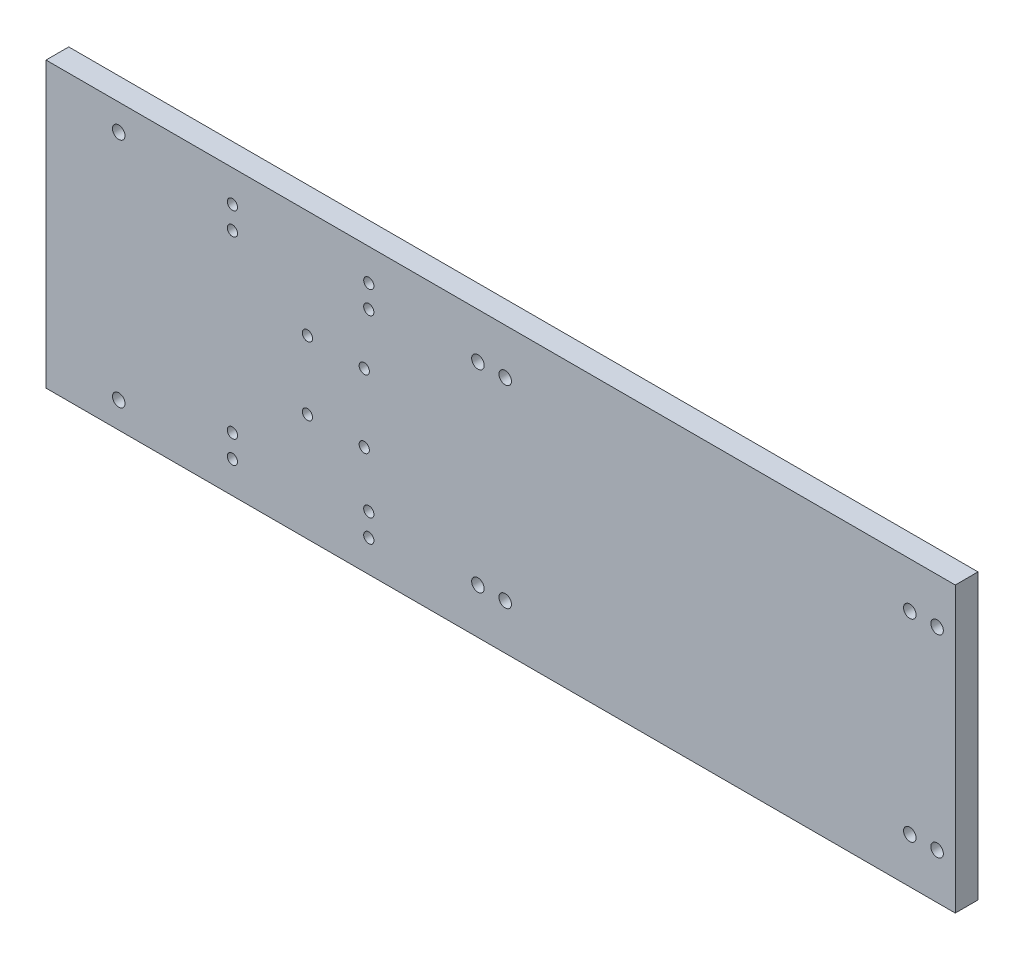
ISO-10303-21;
HEADER;
FILE_DESCRIPTION(('STEP AP214'),'2;1');
FILE_NAME('part.step','',(''),(''),'','','');
FILE_SCHEMA(('AUTOMOTIVE_DESIGN { 1 0 10303 214 1 1 1 1 }'));
ENDSEC;
DATA;
#1=APPLICATION_CONTEXT('core data for automotive mechanical design processes');
#2=APPLICATION_PROTOCOL_DEFINITION('international standard','automotive_design',2000,#1);
#3=PRODUCT_CONTEXT('',#1,'mechanical');
#4=PRODUCT('Part','Part','',(#3));
#5=PRODUCT_RELATED_PRODUCT_CATEGORY('part','',(#4));
#6=PRODUCT_DEFINITION_FORMATION('','',#4);
#7=PRODUCT_DEFINITION_CONTEXT('part definition',#1,'design');
#8=PRODUCT_DEFINITION('design','',#6,#7);
#9=PRODUCT_DEFINITION_SHAPE('','',#8);
#10=(LENGTH_UNIT() NAMED_UNIT(*) SI_UNIT(.MILLI.,.METRE.));
#11=(NAMED_UNIT(*) PLANE_ANGLE_UNIT() SI_UNIT($,.RADIAN.));
#12=(NAMED_UNIT(*) SI_UNIT($,.STERADIAN.) SOLID_ANGLE_UNIT());
#13=UNCERTAINTY_MEASURE_WITH_UNIT(LENGTH_MEASURE(1.E-05),#10,'distance_accuracy_value','');
#14=(GEOMETRIC_REPRESENTATION_CONTEXT(3) GLOBAL_UNCERTAINTY_ASSIGNED_CONTEXT((#13)) GLOBAL_UNIT_ASSIGNED_CONTEXT((#10,
#11,#12)) REPRESENTATION_CONTEXT('',''));
#15=CARTESIAN_POINT('',(0.,0.,0.));
#16=DIRECTION('',(0.,0.,1.));
#17=DIRECTION('',(1.,0.,0.));
#18=AXIS2_PLACEMENT_3D('',#15,#16,#17);
#19=CARTESIAN_POINT('',(200.,-62.5,10.));
#20=DIRECTION('',(-1.,0.,0.));
#21=DIRECTION('',(0.,0.,1.));
#22=AXIS2_PLACEMENT_3D('',#19,#20,#21);
#23=PLANE('',#22);
#24=DIRECTION('',(0.,1.,0.));
#25=VECTOR('',#24,1.);
#26=CARTESIAN_POINT('',(200.,-62.5,0.));
#27=LINE('',#26,#25);
#28=CARTESIAN_POINT('',(200.,-62.5,0.));
#29=VERTEX_POINT('',#28);
#30=CARTESIAN_POINT('',(200.,62.5,0.));
#31=VERTEX_POINT('',#30);
#32=EDGE_CURVE('E97',#29,#31,#27,.T.);
#33=ORIENTED_EDGE('',*,*,#32,.T.);
#34=DIRECTION('',(0.,0.,-1.));
#35=VECTOR('',#34,1.);
#36=CARTESIAN_POINT('',(200.,62.5,10.));
#37=LINE('',#36,#35);
#38=CARTESIAN_POINT('',(200.,62.5,10.));
#39=VERTEX_POINT('',#38);
#40=EDGE_CURVE('E11',#39,#31,#37,.T.);
#41=ORIENTED_EDGE('',*,*,#40,.F.);
#42=DIRECTION('',(0.,1.,0.));
#43=VECTOR('',#42,1.);
#44=CARTESIAN_POINT('',(200.,-62.5,10.));
#45=LINE('',#44,#43);
#46=CARTESIAN_POINT('',(200.,-62.5,10.));
#47=VERTEX_POINT('',#46);
#48=EDGE_CURVE('E85',#47,#39,#45,.T.);
#49=ORIENTED_EDGE('',*,*,#48,.F.);
#50=DIRECTION('',(0.,0.,-1.));
#51=VECTOR('',#50,1.);
#52=CARTESIAN_POINT('',(200.,-62.5,10.));
#53=LINE('',#52,#51);
#54=EDGE_CURVE('E93',#47,#29,#53,.T.);
#55=ORIENTED_EDGE('',*,*,#54,.T.);
#56=EDGE_LOOP('',(#33,#41,#49,#55));
#57=FACE_BOUND('',#56,.T.);
#58=ADVANCED_FACE('F34',(#57),#23,.F.);
#59=CARTESIAN_POINT('',(-200.,62.5,10.));
#60=DIRECTION('',(0.,-1.,0.));
#61=DIRECTION('',(0.,0.,-1.));
#62=AXIS2_PLACEMENT_3D('',#59,#60,#61);
#63=PLANE('',#62);
#64=DIRECTION('',(-1.,0.,0.));
#65=VECTOR('',#64,1.);
#66=CARTESIAN_POINT('',(-200.,62.5,0.));
#67=LINE('',#66,#65);
#68=CARTESIAN_POINT('',(-200.,62.5,0.));
#69=VERTEX_POINT('',#68);
#70=EDGE_CURVE('E89',#31,#69,#67,.T.);
#71=ORIENTED_EDGE('',*,*,#70,.T.);
#72=DIRECTION('',(0.,0.,-1.));
#73=VECTOR('',#72,1.);
#74=CARTESIAN_POINT('',(-200.,62.5,10.));
#75=LINE('',#74,#73);
#76=CARTESIAN_POINT('',(-200.,62.5,10.));
#77=VERTEX_POINT('',#76);
#78=EDGE_CURVE('E42',#77,#69,#75,.T.);
#79=ORIENTED_EDGE('',*,*,#78,.F.);
#80=DIRECTION('',(-1.,0.,0.));
#81=VECTOR('',#80,1.);
#82=CARTESIAN_POINT('',(-200.,62.5,10.));
#83=LINE('',#82,#81);
#84=EDGE_CURVE('E80',#39,#77,#83,.T.);
#85=ORIENTED_EDGE('',*,*,#84,.F.);
#86=ORIENTED_EDGE('',*,*,#40,.T.);
#87=EDGE_LOOP('',(#71,#79,#85,#86));
#88=FACE_BOUND('',#87,.T.);
#89=ADVANCED_FACE('F88',(#88),#63,.F.);
#90=CARTESIAN_POINT('',(-200.,-62.5,10.));
#91=DIRECTION('',(1.,0.,0.));
#92=DIRECTION('',(0.,0.,-1.));
#93=AXIS2_PLACEMENT_3D('',#90,#91,#92);
#94=PLANE('',#93);
#95=DIRECTION('',(0.,-1.,0.));
#96=VECTOR('',#95,1.);
#97=CARTESIAN_POINT('',(-200.,-62.5,0.));
#98=LINE('',#97,#96);
#99=CARTESIAN_POINT('',(-200.,-62.5,0.));
#100=VERTEX_POINT('',#99);
#101=EDGE_CURVE('E67',#69,#100,#98,.T.);
#102=ORIENTED_EDGE('',*,*,#101,.T.);
#103=DIRECTION('',(0.,0.,-1.));
#104=VECTOR('',#103,1.);
#105=CARTESIAN_POINT('',(-200.,-62.5,10.));
#106=LINE('',#105,#104);
#107=CARTESIAN_POINT('',(-200.,-62.5,10.));
#108=VERTEX_POINT('',#107);
#109=EDGE_CURVE('E90',#108,#100,#106,.T.);
#110=ORIENTED_EDGE('',*,*,#109,.F.);
#111=DIRECTION('',(0.,-1.,0.));
#112=VECTOR('',#111,1.);
#113=CARTESIAN_POINT('',(-200.,-62.5,10.));
#114=LINE('',#113,#112);
#115=EDGE_CURVE('E83',#77,#108,#114,.T.);
#116=ORIENTED_EDGE('',*,*,#115,.F.);
#117=ORIENTED_EDGE('',*,*,#78,.T.);
#118=EDGE_LOOP('',(#102,#110,#116,#117));
#119=FACE_BOUND('',#118,.T.);
#120=ADVANCED_FACE('F91',(#119),#94,.F.);
#121=CARTESIAN_POINT('',(-200.,-62.5,10.));
#122=DIRECTION('',(0.,1.,0.));
#123=DIRECTION('',(0.,0.,1.));
#124=AXIS2_PLACEMENT_3D('',#121,#122,#123);
#125=PLANE('',#124);
#126=DIRECTION('',(1.,0.,0.));
#127=VECTOR('',#126,1.);
#128=CARTESIAN_POINT('',(-200.,-62.5,0.));
#129=LINE('',#128,#127);
#130=EDGE_CURVE('E73',#100,#29,#129,.T.);
#131=ORIENTED_EDGE('',*,*,#130,.T.);
#132=ORIENTED_EDGE('',*,*,#54,.F.);
#133=DIRECTION('',(1.,0.,0.));
#134=VECTOR('',#133,1.);
#135=CARTESIAN_POINT('',(-200.,-62.5,10.));
#136=LINE('',#135,#134);
#137=EDGE_CURVE('E50',#108,#47,#136,.T.);
#138=ORIENTED_EDGE('',*,*,#137,.F.);
#139=ORIENTED_EDGE('',*,*,#109,.T.);
#140=EDGE_LOOP('',(#131,#132,#138,#139));
#141=FACE_BOUND('',#140,.T.);
#142=ADVANCED_FACE('F105',(#141),#125,.F.);
#143=CARTESIAN_POINT('',(0.,0.,10.));
#144=DIRECTION('',(0.,0.,-1.));
#145=DIRECTION('',(-1.,0.,0.));
#146=AXIS2_PLACEMENT_3D('',#143,#144,#145);
#147=PLANE('',#146);
#148=CARTESIAN_POINT('',(-58.,38.5,10.));
#149=DIRECTION('',(0.,0.,-1.));
#150=DIRECTION('',(-1.,0.,0.));
#151=AXIS2_PLACEMENT_3D('',#148,#149,#150);
#152=CIRCLE('',#151,2.25);
#153=CARTESIAN_POINT('',(-60.25,38.5,10.));
#154=VERTEX_POINT('',#153);
#155=EDGE_CURVE('E236',#154,#154,#152,.T.);
#156=ORIENTED_EDGE('',*,*,#155,.T.);
#157=EDGE_LOOP('',(#156));
#158=FACE_BOUND('',#157,.T.);
#159=CARTESIAN_POINT('',(-118.,38.5,10.));
#160=DIRECTION('',(0.,0.,-1.));
#161=DIRECTION('',(-1.,0.,0.));
#162=AXIS2_PLACEMENT_3D('',#159,#160,#161);
#163=CIRCLE('',#162,2.25);
#164=CARTESIAN_POINT('',(-120.25,38.5,10.));
#165=VERTEX_POINT('',#164);
#166=EDGE_CURVE('E230',#165,#165,#163,.T.);
#167=ORIENTED_EDGE('',*,*,#166,.T.);
#168=EDGE_LOOP('',(#167));
#169=FACE_BOUND('',#168,.T.);
#170=CARTESIAN_POINT('',(-118.,-38.5,10.));
#171=DIRECTION('',(0.,0.,-1.));
#172=DIRECTION('',(-1.,0.,0.));
#173=AXIS2_PLACEMENT_3D('',#170,#171,#172);
#174=CIRCLE('',#173,2.25);
#175=CARTESIAN_POINT('',(-120.25,-38.5,10.));
#176=VERTEX_POINT('',#175);
#177=EDGE_CURVE('E224',#176,#176,#174,.T.);
#178=ORIENTED_EDGE('',*,*,#177,.T.);
#179=EDGE_LOOP('',(#178));
#180=FACE_BOUND('',#179,.T.);
#181=CARTESIAN_POINT('',(-58.,-38.5,10.));
#182=DIRECTION('',(0.,0.,-1.));
#183=DIRECTION('',(-1.,0.,0.));
#184=AXIS2_PLACEMENT_3D('',#181,#182,#183);
#185=CIRCLE('',#184,2.25);
#186=CARTESIAN_POINT('',(-60.25,-38.5,10.));
#187=VERTEX_POINT('',#186);
#188=EDGE_CURVE('E218',#187,#187,#185,.T.);
#189=ORIENTED_EDGE('',*,*,#188,.T.);
#190=EDGE_LOOP('',(#189));
#191=FACE_BOUND('',#190,.T.);
#192=CARTESIAN_POINT('',(-60.,-15.,10.));
#193=DIRECTION('',(0.,0.,-1.));
#194=DIRECTION('',(-1.,0.,0.));
#195=AXIS2_PLACEMENT_3D('',#192,#193,#194);
#196=CIRCLE('',#195,2.25);
#197=CARTESIAN_POINT('',(-62.25,-15.,10.));
#198=VERTEX_POINT('',#197);
#199=EDGE_CURVE('E212',#198,#198,#196,.T.);
#200=ORIENTED_EDGE('',*,*,#199,.T.);
#201=EDGE_LOOP('',(#200));
#202=FACE_BOUND('',#201,.T.);
#203=CARTESIAN_POINT('',(-85.,-15.,10.));
#204=DIRECTION('',(0.,0.,-1.));
#205=DIRECTION('',(-1.,0.,0.));
#206=AXIS2_PLACEMENT_3D('',#203,#204,#205);
#207=CIRCLE('',#206,2.25);
#208=CARTESIAN_POINT('',(-87.25,-15.,10.));
#209=VERTEX_POINT('',#208);
#210=EDGE_CURVE('E206',#209,#209,#207,.T.);
#211=ORIENTED_EDGE('',*,*,#210,.T.);
#212=EDGE_LOOP('',(#211));
#213=FACE_BOUND('',#212,.T.);
#214=CARTESIAN_POINT('',(-85.,15.,10.));
#215=DIRECTION('',(0.,0.,-1.));
#216=DIRECTION('',(-1.,0.,0.));
#217=AXIS2_PLACEMENT_3D('',#214,#215,#216);
#218=CIRCLE('',#217,2.25);
#219=CARTESIAN_POINT('',(-87.25,15.,10.));
#220=VERTEX_POINT('',#219);
#221=EDGE_CURVE('E200',#220,#220,#218,.T.);
#222=ORIENTED_EDGE('',*,*,#221,.T.);
#223=EDGE_LOOP('',(#222));
#224=FACE_BOUND('',#223,.T.);
#225=CARTESIAN_POINT('',(-60.,14.9999999999999,10.));
#226=DIRECTION('',(0.,0.,-1.));
#227=DIRECTION('',(-1.,0.,0.));
#228=AXIS2_PLACEMENT_3D('',#225,#226,#227);
#229=CIRCLE('',#228,2.25);
#230=CARTESIAN_POINT('',(-62.25,14.9999999999999,10.));
#231=VERTEX_POINT('',#230);
#232=EDGE_CURVE('E194',#231,#231,#229,.T.);
#233=ORIENTED_EDGE('',*,*,#232,.T.);
#234=EDGE_LOOP('',(#233));
#235=FACE_BOUND('',#234,.T.);
#236=CARTESIAN_POINT('',(-58.,-48.5,10.));
#237=DIRECTION('',(0.,0.,-1.));
#238=DIRECTION('',(-1.,0.,0.));
#239=AXIS2_PLACEMENT_3D('',#236,#237,#238);
#240=CIRCLE('',#239,2.25);
#241=CARTESIAN_POINT('',(-60.25,-48.5,10.));
#242=VERTEX_POINT('',#241);
#243=EDGE_CURVE('E188',#242,#242,#240,.T.);
#244=ORIENTED_EDGE('',*,*,#243,.T.);
#245=EDGE_LOOP('',(#244));
#246=FACE_BOUND('',#245,.T.);
#247=CARTESIAN_POINT('',(-118.,-48.5000000000001,10.));
#248=DIRECTION('',(0.,0.,-1.));
#249=DIRECTION('',(-1.,0.,0.));
#250=AXIS2_PLACEMENT_3D('',#247,#248,#249);
#251=CIRCLE('',#250,2.25);
#252=CARTESIAN_POINT('',(-120.25,-48.5000000000001,10.));
#253=VERTEX_POINT('',#252);
#254=EDGE_CURVE('E182',#253,#253,#251,.T.);
#255=ORIENTED_EDGE('',*,*,#254,.T.);
#256=EDGE_LOOP('',(#255));
#257=FACE_BOUND('',#256,.T.);
#258=CARTESIAN_POINT('',(-58.,48.5,10.));
#259=DIRECTION('',(0.,0.,-1.));
#260=DIRECTION('',(-1.,0.,0.));
#261=AXIS2_PLACEMENT_3D('',#258,#259,#260);
#262=CIRCLE('',#261,2.25);
#263=CARTESIAN_POINT('',(-60.25,48.5,10.));
#264=VERTEX_POINT('',#263);
#265=EDGE_CURVE('E176',#264,#264,#262,.T.);
#266=ORIENTED_EDGE('',*,*,#265,.T.);
#267=EDGE_LOOP('',(#266));
#268=FACE_BOUND('',#267,.T.);
#269=CARTESIAN_POINT('',(-118.,48.5,10.));
#270=DIRECTION('',(0.,0.,-1.));
#271=DIRECTION('',(-1.,0.,0.));
#272=AXIS2_PLACEMENT_3D('',#269,#270,#271);
#273=CIRCLE('',#272,2.25);
#274=CARTESIAN_POINT('',(-120.25,48.5,10.));
#275=VERTEX_POINT('',#274);
#276=EDGE_CURVE('E170',#275,#275,#273,.T.);
#277=ORIENTED_EDGE('',*,*,#276,.T.);
#278=EDGE_LOOP('',(#277));
#279=FACE_BOUND('',#278,.T.);
#280=CARTESIAN_POINT('',(192.,42.5,10.));
#281=DIRECTION('',(0.,0.,-1.));
#282=DIRECTION('',(-1.,0.,0.));
#283=AXIS2_PLACEMENT_3D('',#280,#281,#282);
#284=CIRCLE('',#283,2.75);
#285=CARTESIAN_POINT('',(189.25,42.5,10.));
#286=VERTEX_POINT('',#285);
#287=EDGE_CURVE('E164',#286,#286,#284,.T.);
#288=ORIENTED_EDGE('',*,*,#287,.T.);
#289=EDGE_LOOP('',(#288));
#290=FACE_BOUND('',#289,.T.);
#291=CARTESIAN_POINT('',(180.,42.5,10.));
#292=DIRECTION('',(0.,0.,-1.));
#293=DIRECTION('',(-1.,0.,0.));
#294=AXIS2_PLACEMENT_3D('',#291,#292,#293);
#295=CIRCLE('',#294,2.75);
#296=CARTESIAN_POINT('',(177.25,42.5,10.));
#297=VERTEX_POINT('',#296);
#298=EDGE_CURVE('E158',#297,#297,#295,.T.);
#299=ORIENTED_EDGE('',*,*,#298,.T.);
#300=EDGE_LOOP('',(#299));
#301=FACE_BOUND('',#300,.T.);
#302=CARTESIAN_POINT('',(192.,-42.5,10.));
#303=DIRECTION('',(0.,0.,-1.));
#304=DIRECTION('',(-1.,0.,0.));
#305=AXIS2_PLACEMENT_3D('',#302,#303,#304);
#306=CIRCLE('',#305,2.75);
#307=CARTESIAN_POINT('',(189.25,-42.5,10.));
#308=VERTEX_POINT('',#307);
#309=EDGE_CURVE('E152',#308,#308,#306,.T.);
#310=ORIENTED_EDGE('',*,*,#309,.T.);
#311=EDGE_LOOP('',(#310));
#312=FACE_BOUND('',#311,.T.);
#313=CARTESIAN_POINT('',(180.,-42.5,10.));
#314=DIRECTION('',(0.,0.,-1.));
#315=DIRECTION('',(-1.,0.,0.));
#316=AXIS2_PLACEMENT_3D('',#313,#314,#315);
#317=CIRCLE('',#316,2.75);
#318=CARTESIAN_POINT('',(177.25,-42.5,10.));
#319=VERTEX_POINT('',#318);
#320=EDGE_CURVE('E146',#319,#319,#317,.T.);
#321=ORIENTED_EDGE('',*,*,#320,.T.);
#322=EDGE_LOOP('',(#321));
#323=FACE_BOUND('',#322,.T.);
#324=CARTESIAN_POINT('',(2.,42.5,10.));
#325=DIRECTION('',(0.,0.,-1.));
#326=DIRECTION('',(-1.,0.,0.));
#327=AXIS2_PLACEMENT_3D('',#324,#325,#326);
#328=CIRCLE('',#327,2.75);
#329=CARTESIAN_POINT('',(-0.749999999999997,42.5,10.));
#330=VERTEX_POINT('',#329);
#331=EDGE_CURVE('E140',#330,#330,#328,.T.);
#332=ORIENTED_EDGE('',*,*,#331,.T.);
#333=EDGE_LOOP('',(#332));
#334=FACE_BOUND('',#333,.T.);
#335=CARTESIAN_POINT('',(-9.99999999999999,42.5,10.));
#336=DIRECTION('',(0.,0.,-1.));
#337=DIRECTION('',(-1.,0.,0.));
#338=AXIS2_PLACEMENT_3D('',#335,#336,#337);
#339=CIRCLE('',#338,2.75);
#340=CARTESIAN_POINT('',(-12.75,42.5,10.));
#341=VERTEX_POINT('',#340);
#342=EDGE_CURVE('E134',#341,#341,#339,.T.);
#343=ORIENTED_EDGE('',*,*,#342,.T.);
#344=EDGE_LOOP('',(#343));
#345=FACE_BOUND('',#344,.T.);
#346=CARTESIAN_POINT('',(2.00000000000001,-42.5,10.));
#347=DIRECTION('',(0.,0.,-1.));
#348=DIRECTION('',(-1.,0.,0.));
#349=AXIS2_PLACEMENT_3D('',#346,#347,#348);
#350=CIRCLE('',#349,2.75);
#351=CARTESIAN_POINT('',(-0.749999999999987,-42.5,10.));
#352=VERTEX_POINT('',#351);
#353=EDGE_CURVE('E128',#352,#352,#350,.T.);
#354=ORIENTED_EDGE('',*,*,#353,.T.);
#355=EDGE_LOOP('',(#354));
#356=FACE_BOUND('',#355,.T.);
#357=CARTESIAN_POINT('',(-9.99999999999999,-42.5,10.));
#358=DIRECTION('',(0.,0.,-1.));
#359=DIRECTION('',(-1.,0.,0.));
#360=AXIS2_PLACEMENT_3D('',#357,#358,#359);
#361=CIRCLE('',#360,2.75);
#362=CARTESIAN_POINT('',(-12.75,-42.5,10.));
#363=VERTEX_POINT('',#362);
#364=EDGE_CURVE('E122',#363,#363,#361,.T.);
#365=ORIENTED_EDGE('',*,*,#364,.T.);
#366=EDGE_LOOP('',(#365));
#367=FACE_BOUND('',#366,.T.);
#368=CARTESIAN_POINT('',(-168.,50.9999999999999,10.));
#369=DIRECTION('',(0.,0.,-1.));
#370=DIRECTION('',(-1.,0.,0.));
#371=AXIS2_PLACEMENT_3D('',#368,#369,#370);
#372=CIRCLE('',#371,2.75);
#373=CARTESIAN_POINT('',(-170.75,50.9999999999999,10.));
#374=VERTEX_POINT('',#373);
#375=EDGE_CURVE('E116',#374,#374,#372,.T.);
#376=ORIENTED_EDGE('',*,*,#375,.T.);
#377=EDGE_LOOP('',(#376));
#378=FACE_BOUND('',#377,.T.);
#379=CARTESIAN_POINT('',(-168.,-51.,10.));
#380=DIRECTION('',(0.,0.,-1.));
#381=DIRECTION('',(-1.,0.,0.));
#382=AXIS2_PLACEMENT_3D('',#379,#380,#381);
#383=CIRCLE('',#382,2.75);
#384=CARTESIAN_POINT('',(-170.75,-51.,10.));
#385=VERTEX_POINT('',#384);
#386=EDGE_CURVE('E100',#385,#385,#383,.T.);
#387=ORIENTED_EDGE('',*,*,#386,.T.);
#388=EDGE_LOOP('',(#387));
#389=FACE_BOUND('',#388,.T.);
#390=ORIENTED_EDGE('',*,*,#48,.T.);
#391=ORIENTED_EDGE('',*,*,#84,.T.);
#392=ORIENTED_EDGE('',*,*,#115,.T.);
#393=ORIENTED_EDGE('',*,*,#137,.T.);
#394=EDGE_LOOP('',(#390,#391,#392,#393));
#395=FACE_BOUND('',#394,.T.);
#396=ADVANCED_FACE('F81',(#158,#169,#180,#191,#202,#213,#224,#235,#246,#257,#268,#279,#290,#301,
#312,#323,#334,#345,#356,#367,#378,#389,#395),#147,.F.);
#397=CARTESIAN_POINT('',(0.,0.,0.));
#398=DIRECTION('',(0.,0.,-1.));
#399=DIRECTION('',(-1.,0.,0.));
#400=AXIS2_PLACEMENT_3D('',#397,#398,#399);
#401=PLANE('',#400);
#402=CARTESIAN_POINT('',(-58.,38.5,0.));
#403=DIRECTION('',(0.,0.,-1.));
#404=DIRECTION('',(-1.,0.,0.));
#405=AXIS2_PLACEMENT_3D('',#402,#403,#404);
#406=CIRCLE('',#405,2.25);
#407=CARTESIAN_POINT('',(-60.25,38.5,0.));
#408=VERTEX_POINT('',#407);
#409=EDGE_CURVE('E239',#408,#408,#406,.T.);
#410=ORIENTED_EDGE('',*,*,#409,.F.);
#411=EDGE_LOOP('',(#410));
#412=FACE_BOUND('',#411,.T.);
#413=CARTESIAN_POINT('',(-118.,38.5,0.));
#414=DIRECTION('',(0.,0.,-1.));
#415=DIRECTION('',(-1.,0.,0.));
#416=AXIS2_PLACEMENT_3D('',#413,#414,#415);
#417=CIRCLE('',#416,2.25);
#418=CARTESIAN_POINT('',(-120.25,38.5,0.));
#419=VERTEX_POINT('',#418);
#420=EDGE_CURVE('E233',#419,#419,#417,.T.);
#421=ORIENTED_EDGE('',*,*,#420,.F.);
#422=EDGE_LOOP('',(#421));
#423=FACE_BOUND('',#422,.T.);
#424=CARTESIAN_POINT('',(-118.,-38.5,0.));
#425=DIRECTION('',(0.,0.,-1.));
#426=DIRECTION('',(-1.,0.,0.));
#427=AXIS2_PLACEMENT_3D('',#424,#425,#426);
#428=CIRCLE('',#427,2.25);
#429=CARTESIAN_POINT('',(-120.25,-38.5,0.));
#430=VERTEX_POINT('',#429);
#431=EDGE_CURVE('E227',#430,#430,#428,.T.);
#432=ORIENTED_EDGE('',*,*,#431,.F.);
#433=EDGE_LOOP('',(#432));
#434=FACE_BOUND('',#433,.T.);
#435=CARTESIAN_POINT('',(-58.,-38.5,0.));
#436=DIRECTION('',(0.,0.,-1.));
#437=DIRECTION('',(-1.,0.,0.));
#438=AXIS2_PLACEMENT_3D('',#435,#436,#437);
#439=CIRCLE('',#438,2.25);
#440=CARTESIAN_POINT('',(-60.25,-38.5,0.));
#441=VERTEX_POINT('',#440);
#442=EDGE_CURVE('E221',#441,#441,#439,.T.);
#443=ORIENTED_EDGE('',*,*,#442,.F.);
#444=EDGE_LOOP('',(#443));
#445=FACE_BOUND('',#444,.T.);
#446=CARTESIAN_POINT('',(-60.,-15.,0.));
#447=DIRECTION('',(0.,0.,-1.));
#448=DIRECTION('',(-1.,0.,0.));
#449=AXIS2_PLACEMENT_3D('',#446,#447,#448);
#450=CIRCLE('',#449,2.25);
#451=CARTESIAN_POINT('',(-62.25,-15.,0.));
#452=VERTEX_POINT('',#451);
#453=EDGE_CURVE('E215',#452,#452,#450,.T.);
#454=ORIENTED_EDGE('',*,*,#453,.F.);
#455=EDGE_LOOP('',(#454));
#456=FACE_BOUND('',#455,.T.);
#457=CARTESIAN_POINT('',(-85.,-15.,0.));
#458=DIRECTION('',(0.,0.,-1.));
#459=DIRECTION('',(-1.,0.,0.));
#460=AXIS2_PLACEMENT_3D('',#457,#458,#459);
#461=CIRCLE('',#460,2.25);
#462=CARTESIAN_POINT('',(-87.25,-15.,0.));
#463=VERTEX_POINT('',#462);
#464=EDGE_CURVE('E209',#463,#463,#461,.T.);
#465=ORIENTED_EDGE('',*,*,#464,.F.);
#466=EDGE_LOOP('',(#465));
#467=FACE_BOUND('',#466,.T.);
#468=CARTESIAN_POINT('',(-85.,15.,0.));
#469=DIRECTION('',(0.,0.,-1.));
#470=DIRECTION('',(-1.,0.,0.));
#471=AXIS2_PLACEMENT_3D('',#468,#469,#470);
#472=CIRCLE('',#471,2.25);
#473=CARTESIAN_POINT('',(-87.25,15.,0.));
#474=VERTEX_POINT('',#473);
#475=EDGE_CURVE('E203',#474,#474,#472,.T.);
#476=ORIENTED_EDGE('',*,*,#475,.F.);
#477=EDGE_LOOP('',(#476));
#478=FACE_BOUND('',#477,.T.);
#479=CARTESIAN_POINT('',(-60.,14.9999999999999,0.));
#480=DIRECTION('',(0.,0.,-1.));
#481=DIRECTION('',(-1.,0.,0.));
#482=AXIS2_PLACEMENT_3D('',#479,#480,#481);
#483=CIRCLE('',#482,2.25);
#484=CARTESIAN_POINT('',(-62.25,14.9999999999999,0.));
#485=VERTEX_POINT('',#484);
#486=EDGE_CURVE('E197',#485,#485,#483,.T.);
#487=ORIENTED_EDGE('',*,*,#486,.F.);
#488=EDGE_LOOP('',(#487));
#489=FACE_BOUND('',#488,.T.);
#490=CARTESIAN_POINT('',(-58.,-48.5,0.));
#491=DIRECTION('',(0.,0.,-1.));
#492=DIRECTION('',(-1.,0.,0.));
#493=AXIS2_PLACEMENT_3D('',#490,#491,#492);
#494=CIRCLE('',#493,2.25);
#495=CARTESIAN_POINT('',(-60.25,-48.5,0.));
#496=VERTEX_POINT('',#495);
#497=EDGE_CURVE('E191',#496,#496,#494,.T.);
#498=ORIENTED_EDGE('',*,*,#497,.F.);
#499=EDGE_LOOP('',(#498));
#500=FACE_BOUND('',#499,.T.);
#501=CARTESIAN_POINT('',(-118.,-48.5000000000001,0.));
#502=DIRECTION('',(0.,0.,-1.));
#503=DIRECTION('',(-1.,0.,0.));
#504=AXIS2_PLACEMENT_3D('',#501,#502,#503);
#505=CIRCLE('',#504,2.25);
#506=CARTESIAN_POINT('',(-120.25,-48.5000000000001,0.));
#507=VERTEX_POINT('',#506);
#508=EDGE_CURVE('E185',#507,#507,#505,.T.);
#509=ORIENTED_EDGE('',*,*,#508,.F.);
#510=EDGE_LOOP('',(#509));
#511=FACE_BOUND('',#510,.T.);
#512=CARTESIAN_POINT('',(-58.,48.5,0.));
#513=DIRECTION('',(0.,0.,-1.));
#514=DIRECTION('',(-1.,0.,0.));
#515=AXIS2_PLACEMENT_3D('',#512,#513,#514);
#516=CIRCLE('',#515,2.25);
#517=CARTESIAN_POINT('',(-60.25,48.5,0.));
#518=VERTEX_POINT('',#517);
#519=EDGE_CURVE('E179',#518,#518,#516,.T.);
#520=ORIENTED_EDGE('',*,*,#519,.F.);
#521=EDGE_LOOP('',(#520));
#522=FACE_BOUND('',#521,.T.);
#523=CARTESIAN_POINT('',(-118.,48.5,0.));
#524=DIRECTION('',(0.,0.,-1.));
#525=DIRECTION('',(-1.,0.,0.));
#526=AXIS2_PLACEMENT_3D('',#523,#524,#525);
#527=CIRCLE('',#526,2.25);
#528=CARTESIAN_POINT('',(-120.25,48.5,0.));
#529=VERTEX_POINT('',#528);
#530=EDGE_CURVE('E173',#529,#529,#527,.T.);
#531=ORIENTED_EDGE('',*,*,#530,.F.);
#532=EDGE_LOOP('',(#531));
#533=FACE_BOUND('',#532,.T.);
#534=CARTESIAN_POINT('',(192.,42.5,0.));
#535=DIRECTION('',(0.,0.,-1.));
#536=DIRECTION('',(-1.,0.,0.));
#537=AXIS2_PLACEMENT_3D('',#534,#535,#536);
#538=CIRCLE('',#537,2.75);
#539=CARTESIAN_POINT('',(189.25,42.5,0.));
#540=VERTEX_POINT('',#539);
#541=EDGE_CURVE('E167',#540,#540,#538,.T.);
#542=ORIENTED_EDGE('',*,*,#541,.F.);
#543=EDGE_LOOP('',(#542));
#544=FACE_BOUND('',#543,.T.);
#545=CARTESIAN_POINT('',(180.,42.5,0.));
#546=DIRECTION('',(0.,0.,-1.));
#547=DIRECTION('',(-1.,0.,0.));
#548=AXIS2_PLACEMENT_3D('',#545,#546,#547);
#549=CIRCLE('',#548,2.75);
#550=CARTESIAN_POINT('',(177.25,42.5,0.));
#551=VERTEX_POINT('',#550);
#552=EDGE_CURVE('E161',#551,#551,#549,.T.);
#553=ORIENTED_EDGE('',*,*,#552,.F.);
#554=EDGE_LOOP('',(#553));
#555=FACE_BOUND('',#554,.T.);
#556=CARTESIAN_POINT('',(192.,-42.5,0.));
#557=DIRECTION('',(0.,0.,-1.));
#558=DIRECTION('',(-1.,0.,0.));
#559=AXIS2_PLACEMENT_3D('',#556,#557,#558);
#560=CIRCLE('',#559,2.75);
#561=CARTESIAN_POINT('',(189.25,-42.5,0.));
#562=VERTEX_POINT('',#561);
#563=EDGE_CURVE('E155',#562,#562,#560,.T.);
#564=ORIENTED_EDGE('',*,*,#563,.F.);
#565=EDGE_LOOP('',(#564));
#566=FACE_BOUND('',#565,.T.);
#567=CARTESIAN_POINT('',(180.,-42.5,0.));
#568=DIRECTION('',(0.,0.,-1.));
#569=DIRECTION('',(-1.,0.,0.));
#570=AXIS2_PLACEMENT_3D('',#567,#568,#569);
#571=CIRCLE('',#570,2.75);
#572=CARTESIAN_POINT('',(177.25,-42.5,0.));
#573=VERTEX_POINT('',#572);
#574=EDGE_CURVE('E149',#573,#573,#571,.T.);
#575=ORIENTED_EDGE('',*,*,#574,.F.);
#576=EDGE_LOOP('',(#575));
#577=FACE_BOUND('',#576,.T.);
#578=CARTESIAN_POINT('',(2.,42.5,0.));
#579=DIRECTION('',(0.,0.,-1.));
#580=DIRECTION('',(-1.,0.,0.));
#581=AXIS2_PLACEMENT_3D('',#578,#579,#580);
#582=CIRCLE('',#581,2.75);
#583=CARTESIAN_POINT('',(-0.749999999999998,42.5,0.));
#584=VERTEX_POINT('',#583);
#585=EDGE_CURVE('E143',#584,#584,#582,.T.);
#586=ORIENTED_EDGE('',*,*,#585,.F.);
#587=EDGE_LOOP('',(#586));
#588=FACE_BOUND('',#587,.T.);
#589=CARTESIAN_POINT('',(-9.99999999999999,42.5,0.));
#590=DIRECTION('',(0.,0.,-1.));
#591=DIRECTION('',(-1.,0.,0.));
#592=AXIS2_PLACEMENT_3D('',#589,#590,#591);
#593=CIRCLE('',#592,2.75);
#594=CARTESIAN_POINT('',(-12.75,42.5,0.));
#595=VERTEX_POINT('',#594);
#596=EDGE_CURVE('E137',#595,#595,#593,.T.);
#597=ORIENTED_EDGE('',*,*,#596,.F.);
#598=EDGE_LOOP('',(#597));
#599=FACE_BOUND('',#598,.T.);
#600=CARTESIAN_POINT('',(2.00000000000001,-42.5,0.));
#601=DIRECTION('',(0.,0.,-1.));
#602=DIRECTION('',(-1.,0.,0.));
#603=AXIS2_PLACEMENT_3D('',#600,#601,#602);
#604=CIRCLE('',#603,2.75);
#605=CARTESIAN_POINT('',(-0.749999999999988,-42.5,0.));
#606=VERTEX_POINT('',#605);
#607=EDGE_CURVE('E131',#606,#606,#604,.T.);
#608=ORIENTED_EDGE('',*,*,#607,.F.);
#609=EDGE_LOOP('',(#608));
#610=FACE_BOUND('',#609,.T.);
#611=CARTESIAN_POINT('',(-9.99999999999999,-42.5,0.));
#612=DIRECTION('',(0.,0.,-1.));
#613=DIRECTION('',(-1.,0.,0.));
#614=AXIS2_PLACEMENT_3D('',#611,#612,#613);
#615=CIRCLE('',#614,2.75);
#616=CARTESIAN_POINT('',(-12.75,-42.5,0.));
#617=VERTEX_POINT('',#616);
#618=EDGE_CURVE('E125',#617,#617,#615,.T.);
#619=ORIENTED_EDGE('',*,*,#618,.F.);
#620=EDGE_LOOP('',(#619));
#621=FACE_BOUND('',#620,.T.);
#622=CARTESIAN_POINT('',(-168.,50.9999999999999,0.));
#623=DIRECTION('',(0.,0.,-1.));
#624=DIRECTION('',(-1.,0.,0.));
#625=AXIS2_PLACEMENT_3D('',#622,#623,#624);
#626=CIRCLE('',#625,2.75);
#627=CARTESIAN_POINT('',(-170.75,50.9999999999999,0.));
#628=VERTEX_POINT('',#627);
#629=EDGE_CURVE('E119',#628,#628,#626,.T.);
#630=ORIENTED_EDGE('',*,*,#629,.F.);
#631=EDGE_LOOP('',(#630));
#632=FACE_BOUND('',#631,.T.);
#633=CARTESIAN_POINT('',(-168.,-51.,0.));
#634=DIRECTION('',(0.,0.,-1.));
#635=DIRECTION('',(-1.,0.,0.));
#636=AXIS2_PLACEMENT_3D('',#633,#634,#635);
#637=CIRCLE('',#636,2.75);
#638=CARTESIAN_POINT('',(-170.75,-51.,0.));
#639=VERTEX_POINT('',#638);
#640=EDGE_CURVE('E113',#639,#639,#637,.T.);
#641=ORIENTED_EDGE('',*,*,#640,.F.);
#642=EDGE_LOOP('',(#641));
#643=FACE_BOUND('',#642,.T.);
#644=ORIENTED_EDGE('',*,*,#32,.F.);
#645=ORIENTED_EDGE('',*,*,#130,.F.);
#646=ORIENTED_EDGE('',*,*,#101,.F.);
#647=ORIENTED_EDGE('',*,*,#70,.F.);
#648=EDGE_LOOP('',(#644,#645,#646,#647));
#649=FACE_BOUND('',#648,.T.);
#650=ADVANCED_FACE('F108',(#412,#423,#434,#445,#456,#467,#478,#489,#500,#511,#522,#533,#544,
#555,#566,#577,#588,#599,#610,#621,#632,#643,#649),#401,.T.);
#651=CARTESIAN_POINT('',(-168.,-51.,0.));
#652=DIRECTION('',(0.,0.,-1.));
#653=DIRECTION('',(-1.,0.,0.));
#654=AXIS2_PLACEMENT_3D('',#651,#652,#653);
#655=CYLINDRICAL_SURFACE('',#654,2.75);
#656=ORIENTED_EDGE('',*,*,#386,.F.);
#657=EDGE_LOOP('',(#656));
#658=FACE_BOUND('',#657,.T.);
#659=ORIENTED_EDGE('',*,*,#640,.T.);
#660=EDGE_LOOP('',(#659));
#661=FACE_BOUND('',#660,.T.);
#662=ADVANCED_FACE('F247',(#658,#661),#655,.F.);
#663=CARTESIAN_POINT('',(-168.,50.9999999999999,0.));
#664=DIRECTION('',(0.,0.,-1.));
#665=DIRECTION('',(-1.,0.,0.));
#666=AXIS2_PLACEMENT_3D('',#663,#664,#665);
#667=CYLINDRICAL_SURFACE('',#666,2.75);
#668=ORIENTED_EDGE('',*,*,#375,.F.);
#669=EDGE_LOOP('',(#668));
#670=FACE_BOUND('',#669,.T.);
#671=ORIENTED_EDGE('',*,*,#629,.T.);
#672=EDGE_LOOP('',(#671));
#673=FACE_BOUND('',#672,.T.);
#674=ADVANCED_FACE('F292',(#670,#673),#667,.F.);
#675=CARTESIAN_POINT('',(-9.99999999999999,-42.5,0.));
#676=DIRECTION('',(0.,0.,-1.));
#677=DIRECTION('',(-1.,0.,0.));
#678=AXIS2_PLACEMENT_3D('',#675,#676,#677);
#679=CYLINDRICAL_SURFACE('',#678,2.75);
#680=ORIENTED_EDGE('',*,*,#364,.F.);
#681=EDGE_LOOP('',(#680));
#682=FACE_BOUND('',#681,.T.);
#683=ORIENTED_EDGE('',*,*,#618,.T.);
#684=EDGE_LOOP('',(#683));
#685=FACE_BOUND('',#684,.T.);
#686=ADVANCED_FACE('F298',(#682,#685),#679,.F.);
#687=CARTESIAN_POINT('',(2.00000000000001,-42.5,0.));
#688=DIRECTION('',(0.,0.,-1.));
#689=DIRECTION('',(-1.,0.,0.));
#690=AXIS2_PLACEMENT_3D('',#687,#688,#689);
#691=CYLINDRICAL_SURFACE('',#690,2.75);
#692=ORIENTED_EDGE('',*,*,#353,.F.);
#693=EDGE_LOOP('',(#692));
#694=FACE_BOUND('',#693,.T.);
#695=ORIENTED_EDGE('',*,*,#607,.T.);
#696=EDGE_LOOP('',(#695));
#697=FACE_BOUND('',#696,.T.);
#698=ADVANCED_FACE('F363',(#694,#697),#691,.F.);
#699=CARTESIAN_POINT('',(-9.99999999999999,42.5,0.));
#700=DIRECTION('',(0.,0.,-1.));
#701=DIRECTION('',(-1.,0.,0.));
#702=AXIS2_PLACEMENT_3D('',#699,#700,#701);
#703=CYLINDRICAL_SURFACE('',#702,2.75);
#704=ORIENTED_EDGE('',*,*,#342,.F.);
#705=EDGE_LOOP('',(#704));
#706=FACE_BOUND('',#705,.T.);
#707=ORIENTED_EDGE('',*,*,#596,.T.);
#708=EDGE_LOOP('',(#707));
#709=FACE_BOUND('',#708,.T.);
#710=ADVANCED_FACE('F368',(#706,#709),#703,.F.);
#711=CARTESIAN_POINT('',(2.,42.5,0.));
#712=DIRECTION('',(0.,0.,-1.));
#713=DIRECTION('',(-1.,0.,0.));
#714=AXIS2_PLACEMENT_3D('',#711,#712,#713);
#715=CYLINDRICAL_SURFACE('',#714,2.75);
#716=ORIENTED_EDGE('',*,*,#331,.F.);
#717=EDGE_LOOP('',(#716));
#718=FACE_BOUND('',#717,.T.);
#719=ORIENTED_EDGE('',*,*,#585,.T.);
#720=EDGE_LOOP('',(#719));
#721=FACE_BOUND('',#720,.T.);
#722=ADVANCED_FACE('F374',(#718,#721),#715,.F.);
#723=CARTESIAN_POINT('',(180.,-42.5,0.));
#724=DIRECTION('',(0.,0.,-1.));
#725=DIRECTION('',(-1.,0.,0.));
#726=AXIS2_PLACEMENT_3D('',#723,#724,#725);
#727=CYLINDRICAL_SURFACE('',#726,2.75);
#728=ORIENTED_EDGE('',*,*,#320,.F.);
#729=EDGE_LOOP('',(#728));
#730=FACE_BOUND('',#729,.T.);
#731=ORIENTED_EDGE('',*,*,#574,.T.);
#732=EDGE_LOOP('',(#731));
#733=FACE_BOUND('',#732,.T.);
#734=ADVANCED_FACE('F378',(#730,#733),#727,.F.);
#735=CARTESIAN_POINT('',(192.,-42.5,0.));
#736=DIRECTION('',(0.,0.,-1.));
#737=DIRECTION('',(-1.,0.,0.));
#738=AXIS2_PLACEMENT_3D('',#735,#736,#737);
#739=CYLINDRICAL_SURFACE('',#738,2.75);
#740=ORIENTED_EDGE('',*,*,#309,.F.);
#741=EDGE_LOOP('',(#740));
#742=FACE_BOUND('',#741,.T.);
#743=ORIENTED_EDGE('',*,*,#563,.T.);
#744=EDGE_LOOP('',(#743));
#745=FACE_BOUND('',#744,.T.);
#746=ADVANCED_FACE('F382',(#742,#745),#739,.F.);
#747=CARTESIAN_POINT('',(180.,42.5,0.));
#748=DIRECTION('',(0.,0.,-1.));
#749=DIRECTION('',(-1.,0.,0.));
#750=AXIS2_PLACEMENT_3D('',#747,#748,#749);
#751=CYLINDRICAL_SURFACE('',#750,2.75);
#752=ORIENTED_EDGE('',*,*,#298,.F.);
#753=EDGE_LOOP('',(#752));
#754=FACE_BOUND('',#753,.T.);
#755=ORIENTED_EDGE('',*,*,#552,.T.);
#756=EDGE_LOOP('',(#755));
#757=FACE_BOUND('',#756,.T.);
#758=ADVANCED_FACE('F386',(#754,#757),#751,.F.);
#759=CARTESIAN_POINT('',(192.,42.5,0.));
#760=DIRECTION('',(0.,0.,-1.));
#761=DIRECTION('',(-1.,0.,0.));
#762=AXIS2_PLACEMENT_3D('',#759,#760,#761);
#763=CYLINDRICAL_SURFACE('',#762,2.75);
#764=ORIENTED_EDGE('',*,*,#287,.F.);
#765=EDGE_LOOP('',(#764));
#766=FACE_BOUND('',#765,.T.);
#767=ORIENTED_EDGE('',*,*,#541,.T.);
#768=EDGE_LOOP('',(#767));
#769=FACE_BOUND('',#768,.T.);
#770=ADVANCED_FACE('F390',(#766,#769),#763,.F.);
#771=CARTESIAN_POINT('',(-118.,48.5,0.));
#772=DIRECTION('',(0.,0.,-1.));
#773=DIRECTION('',(-1.,0.,0.));
#774=AXIS2_PLACEMENT_3D('',#771,#772,#773);
#775=CYLINDRICAL_SURFACE('',#774,2.25);
#776=ORIENTED_EDGE('',*,*,#276,.F.);
#777=EDGE_LOOP('',(#776));
#778=FACE_BOUND('',#777,.T.);
#779=ORIENTED_EDGE('',*,*,#530,.T.);
#780=EDGE_LOOP('',(#779));
#781=FACE_BOUND('',#780,.T.);
#782=ADVANCED_FACE('F394',(#778,#781),#775,.F.);
#783=CARTESIAN_POINT('',(-58.,48.5,0.));
#784=DIRECTION('',(0.,0.,-1.));
#785=DIRECTION('',(-1.,0.,0.));
#786=AXIS2_PLACEMENT_3D('',#783,#784,#785);
#787=CYLINDRICAL_SURFACE('',#786,2.25);
#788=ORIENTED_EDGE('',*,*,#265,.F.);
#789=EDGE_LOOP('',(#788));
#790=FACE_BOUND('',#789,.T.);
#791=ORIENTED_EDGE('',*,*,#519,.T.);
#792=EDGE_LOOP('',(#791));
#793=FACE_BOUND('',#792,.T.);
#794=ADVANCED_FACE('F398',(#790,#793),#787,.F.);
#795=CARTESIAN_POINT('',(-118.,-48.5000000000001,0.));
#796=DIRECTION('',(0.,0.,-1.));
#797=DIRECTION('',(-1.,0.,0.));
#798=AXIS2_PLACEMENT_3D('',#795,#796,#797);
#799=CYLINDRICAL_SURFACE('',#798,2.25);
#800=ORIENTED_EDGE('',*,*,#254,.F.);
#801=EDGE_LOOP('',(#800));
#802=FACE_BOUND('',#801,.T.);
#803=ORIENTED_EDGE('',*,*,#508,.T.);
#804=EDGE_LOOP('',(#803));
#805=FACE_BOUND('',#804,.T.);
#806=ADVANCED_FACE('F402',(#802,#805),#799,.F.);
#807=CARTESIAN_POINT('',(-58.,-48.5,0.));
#808=DIRECTION('',(0.,0.,-1.));
#809=DIRECTION('',(-1.,0.,0.));
#810=AXIS2_PLACEMENT_3D('',#807,#808,#809);
#811=CYLINDRICAL_SURFACE('',#810,2.25);
#812=ORIENTED_EDGE('',*,*,#243,.F.);
#813=EDGE_LOOP('',(#812));
#814=FACE_BOUND('',#813,.T.);
#815=ORIENTED_EDGE('',*,*,#497,.T.);
#816=EDGE_LOOP('',(#815));
#817=FACE_BOUND('',#816,.T.);
#818=ADVANCED_FACE('F406',(#814,#817),#811,.F.);
#819=CARTESIAN_POINT('',(-60.,14.9999999999999,0.));
#820=DIRECTION('',(0.,0.,-1.));
#821=DIRECTION('',(-1.,0.,0.));
#822=AXIS2_PLACEMENT_3D('',#819,#820,#821);
#823=CYLINDRICAL_SURFACE('',#822,2.25);
#824=ORIENTED_EDGE('',*,*,#232,.F.);
#825=EDGE_LOOP('',(#824));
#826=FACE_BOUND('',#825,.T.);
#827=ORIENTED_EDGE('',*,*,#486,.T.);
#828=EDGE_LOOP('',(#827));
#829=FACE_BOUND('',#828,.T.);
#830=ADVANCED_FACE('F410',(#826,#829),#823,.F.);
#831=CARTESIAN_POINT('',(-85.,15.,0.));
#832=DIRECTION('',(0.,0.,-1.));
#833=DIRECTION('',(-1.,0.,0.));
#834=AXIS2_PLACEMENT_3D('',#831,#832,#833);
#835=CYLINDRICAL_SURFACE('',#834,2.25);
#836=ORIENTED_EDGE('',*,*,#221,.F.);
#837=EDGE_LOOP('',(#836));
#838=FACE_BOUND('',#837,.T.);
#839=ORIENTED_EDGE('',*,*,#475,.T.);
#840=EDGE_LOOP('',(#839));
#841=FACE_BOUND('',#840,.T.);
#842=ADVANCED_FACE('F414',(#838,#841),#835,.F.);
#843=CARTESIAN_POINT('',(-85.,-15.,0.));
#844=DIRECTION('',(0.,0.,-1.));
#845=DIRECTION('',(-1.,0.,0.));
#846=AXIS2_PLACEMENT_3D('',#843,#844,#845);
#847=CYLINDRICAL_SURFACE('',#846,2.25);
#848=ORIENTED_EDGE('',*,*,#210,.F.);
#849=EDGE_LOOP('',(#848));
#850=FACE_BOUND('',#849,.T.);
#851=ORIENTED_EDGE('',*,*,#464,.T.);
#852=EDGE_LOOP('',(#851));
#853=FACE_BOUND('',#852,.T.);
#854=ADVANCED_FACE('F418',(#850,#853),#847,.F.);
#855=CARTESIAN_POINT('',(-60.,-15.,0.));
#856=DIRECTION('',(0.,0.,-1.));
#857=DIRECTION('',(-1.,0.,0.));
#858=AXIS2_PLACEMENT_3D('',#855,#856,#857);
#859=CYLINDRICAL_SURFACE('',#858,2.25);
#860=ORIENTED_EDGE('',*,*,#199,.F.);
#861=EDGE_LOOP('',(#860));
#862=FACE_BOUND('',#861,.T.);
#863=ORIENTED_EDGE('',*,*,#453,.T.);
#864=EDGE_LOOP('',(#863));
#865=FACE_BOUND('',#864,.T.);
#866=ADVANCED_FACE('F422',(#862,#865),#859,.F.);
#867=CARTESIAN_POINT('',(-58.,-38.5,0.));
#868=DIRECTION('',(0.,0.,-1.));
#869=DIRECTION('',(-1.,0.,0.));
#870=AXIS2_PLACEMENT_3D('',#867,#868,#869);
#871=CYLINDRICAL_SURFACE('',#870,2.25);
#872=ORIENTED_EDGE('',*,*,#188,.F.);
#873=EDGE_LOOP('',(#872));
#874=FACE_BOUND('',#873,.T.);
#875=ORIENTED_EDGE('',*,*,#442,.T.);
#876=EDGE_LOOP('',(#875));
#877=FACE_BOUND('',#876,.T.);
#878=ADVANCED_FACE('F426',(#874,#877),#871,.F.);
#879=CARTESIAN_POINT('',(-118.,-38.5,0.));
#880=DIRECTION('',(0.,0.,-1.));
#881=DIRECTION('',(-1.,0.,0.));
#882=AXIS2_PLACEMENT_3D('',#879,#880,#881);
#883=CYLINDRICAL_SURFACE('',#882,2.25);
#884=ORIENTED_EDGE('',*,*,#177,.F.);
#885=EDGE_LOOP('',(#884));
#886=FACE_BOUND('',#885,.T.);
#887=ORIENTED_EDGE('',*,*,#431,.T.);
#888=EDGE_LOOP('',(#887));
#889=FACE_BOUND('',#888,.T.);
#890=ADVANCED_FACE('F430',(#886,#889),#883,.F.);
#891=CARTESIAN_POINT('',(-118.,38.5,0.));
#892=DIRECTION('',(0.,0.,-1.));
#893=DIRECTION('',(-1.,0.,0.));
#894=AXIS2_PLACEMENT_3D('',#891,#892,#893);
#895=CYLINDRICAL_SURFACE('',#894,2.25);
#896=ORIENTED_EDGE('',*,*,#166,.F.);
#897=EDGE_LOOP('',(#896));
#898=FACE_BOUND('',#897,.T.);
#899=ORIENTED_EDGE('',*,*,#420,.T.);
#900=EDGE_LOOP('',(#899));
#901=FACE_BOUND('',#900,.T.);
#902=ADVANCED_FACE('F434',(#898,#901),#895,.F.);
#903=CARTESIAN_POINT('',(-58.,38.5,0.));
#904=DIRECTION('',(0.,0.,-1.));
#905=DIRECTION('',(-1.,0.,0.));
#906=AXIS2_PLACEMENT_3D('',#903,#904,#905);
#907=CYLINDRICAL_SURFACE('',#906,2.25);
#908=ORIENTED_EDGE('',*,*,#155,.F.);
#909=EDGE_LOOP('',(#908));
#910=FACE_BOUND('',#909,.T.);
#911=ORIENTED_EDGE('',*,*,#409,.T.);
#912=EDGE_LOOP('',(#911));
#913=FACE_BOUND('',#912,.T.);
#914=ADVANCED_FACE('F243',(#910,#913),#907,.F.);
#915=CLOSED_SHELL('',(#58,#89,#120,#142,#396,#650,#662,#674,#686,#698,#710,#722,#734,#746,#758,
#770,#782,#794,#806,#818,#830,#842,#854,#866,#878,#890,#902,#914));
#916=MANIFOLD_SOLID_BREP('B2',#915);
#917=ADVANCED_BREP_SHAPE_REPRESENTATION('',(#18,#916),#14);
#918=SHAPE_DEFINITION_REPRESENTATION(#9,#917);
ENDSEC;
END-ISO-10303-21;
